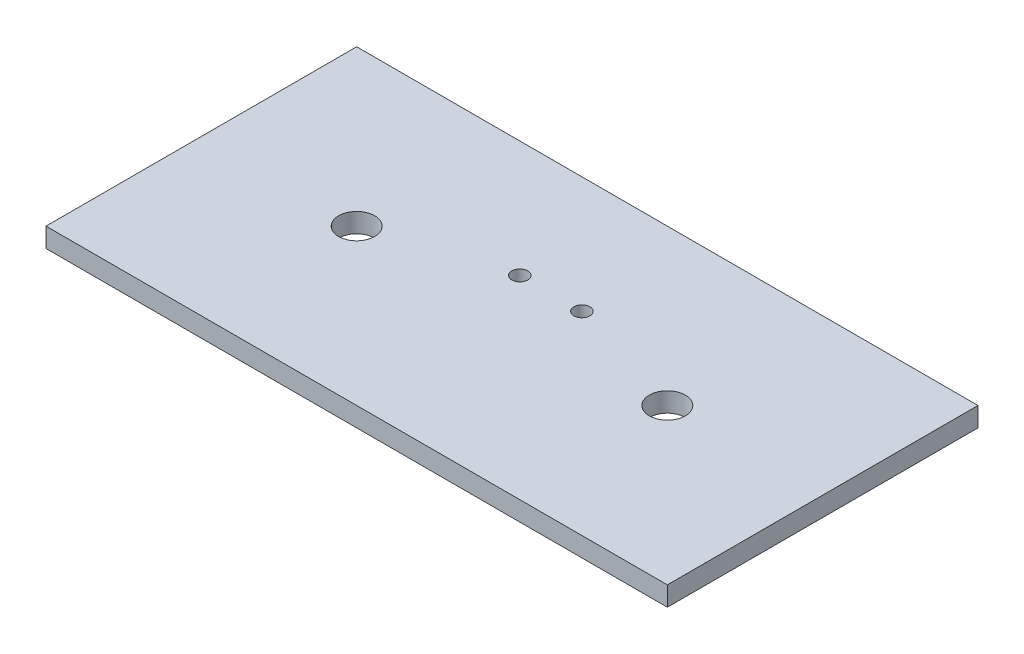
ISO-10303-21;
HEADER;
FILE_DESCRIPTION(('STEP AP214'),'2;1');
FILE_NAME('part.step','',(''),(''),'','','');
FILE_SCHEMA(('AUTOMOTIVE_DESIGN { 1 0 10303 214 1 1 1 1 }'));
ENDSEC;
DATA;
#1=APPLICATION_CONTEXT('core data for automotive mechanical design processes');
#2=APPLICATION_PROTOCOL_DEFINITION('international standard','automotive_design',2000,#1);
#3=PRODUCT_CONTEXT('',#1,'mechanical');
#4=PRODUCT('Part','Part','',(#3));
#5=PRODUCT_RELATED_PRODUCT_CATEGORY('part','',(#4));
#6=PRODUCT_DEFINITION_FORMATION('','',#4);
#7=PRODUCT_DEFINITION_CONTEXT('part definition',#1,'design');
#8=PRODUCT_DEFINITION('design','',#6,#7);
#9=PRODUCT_DEFINITION_SHAPE('','',#8);
#10=(LENGTH_UNIT() NAMED_UNIT(*) SI_UNIT(.MILLI.,.METRE.));
#11=(NAMED_UNIT(*) PLANE_ANGLE_UNIT() SI_UNIT($,.RADIAN.));
#12=(NAMED_UNIT(*) SI_UNIT($,.STERADIAN.) SOLID_ANGLE_UNIT());
#13=UNCERTAINTY_MEASURE_WITH_UNIT(LENGTH_MEASURE(1.E-05),#10,'distance_accuracy_value','');
#14=(GEOMETRIC_REPRESENTATION_CONTEXT(3) GLOBAL_UNCERTAINTY_ASSIGNED_CONTEXT((#13)) GLOBAL_UNIT_ASSIGNED_CONTEXT((#10,
#11,#12)) REPRESENTATION_CONTEXT('',''));
#15=CARTESIAN_POINT('',(0.,0.,0.));
#16=DIRECTION('',(0.,0.,1.));
#17=DIRECTION('',(1.,0.,0.));
#18=AXIS2_PLACEMENT_3D('',#15,#16,#17);
#19=CARTESIAN_POINT('',(0.,1.5875,0.));
#20=DIRECTION('',(0.,-1.,0.));
#21=DIRECTION('',(0.,0.,-1.));
#22=AXIS2_PLACEMENT_3D('',#19,#20,#21);
#23=PLANE('',#22);
#24=CARTESIAN_POINT('',(12.7,1.5875,0.));
#25=DIRECTION('',(0.,1.,0.));
#26=DIRECTION('',(0.,0.,1.));
#27=AXIS2_PLACEMENT_3D('',#24,#25,#26);
#28=CIRCLE('',#27,1.47319999999999);
#29=CARTESIAN_POINT('',(12.7,1.5875,1.47319999999998));
#30=VERTEX_POINT('',#29);
#31=EDGE_CURVE('E133',#30,#30,#28,.T.);
#32=ORIENTED_EDGE('',*,*,#31,.F.);
#33=EDGE_LOOP('',(#32));
#34=FACE_BOUND('',#33,.T.);
#35=CARTESIAN_POINT('',(-2.54,1.5875,-3.175));
#36=DIRECTION('',(0.,1.,0.));
#37=DIRECTION('',(0.,0.,1.));
#38=AXIS2_PLACEMENT_3D('',#35,#36,#37);
#39=CIRCLE('',#38,0.65);
#40=CARTESIAN_POINT('',(-2.54,1.5875,-2.525));
#41=VERTEX_POINT('',#40);
#42=EDGE_CURVE('E126',#41,#41,#39,.T.);
#43=ORIENTED_EDGE('',*,*,#42,.F.);
#44=EDGE_LOOP('',(#43));
#45=FACE_BOUND('',#44,.T.);
#46=CARTESIAN_POINT('',(2.54,1.5875,-3.175));
#47=DIRECTION('',(0.,1.,0.));
#48=DIRECTION('',(0.,0.,1.));
#49=AXIS2_PLACEMENT_3D('',#46,#47,#48);
#50=CIRCLE('',#49,0.65);
#51=CARTESIAN_POINT('',(2.54,1.5875,-2.525));
#52=VERTEX_POINT('',#51);
#53=EDGE_CURVE('E122',#52,#52,#50,.T.);
#54=ORIENTED_EDGE('',*,*,#53,.F.);
#55=EDGE_LOOP('',(#54));
#56=FACE_BOUND('',#55,.T.);
#57=DIRECTION('',(0.,0.,-1.));
#58=VECTOR('',#57,1.);
#59=CARTESIAN_POINT('',(25.4,1.5875,12.7));
#60=LINE('',#59,#58);
#61=CARTESIAN_POINT('',(25.4,1.5875,12.7));
#62=VERTEX_POINT('',#61);
#63=CARTESIAN_POINT('',(25.4,1.5875,-12.7));
#64=VERTEX_POINT('',#63);
#65=EDGE_CURVE('E93',#62,#64,#60,.T.);
#66=ORIENTED_EDGE('',*,*,#65,.T.);
#67=DIRECTION('',(-1.,0.,0.));
#68=VECTOR('',#67,1.);
#69=CARTESIAN_POINT('',(-25.4,1.5875,-12.7));
#70=LINE('',#69,#68);
#71=CARTESIAN_POINT('',(-25.4,1.5875,-12.7));
#72=VERTEX_POINT('',#71);
#73=EDGE_CURVE('E88',#64,#72,#70,.T.);
#74=ORIENTED_EDGE('',*,*,#73,.T.);
#75=DIRECTION('',(0.,0.,1.));
#76=VECTOR('',#75,1.);
#77=CARTESIAN_POINT('',(-25.4,1.5875,12.7));
#78=LINE('',#77,#76);
#79=CARTESIAN_POINT('',(-25.4,1.5875,12.7));
#80=VERTEX_POINT('',#79);
#81=EDGE_CURVE('E91',#72,#80,#78,.T.);
#82=ORIENTED_EDGE('',*,*,#81,.T.);
#83=DIRECTION('',(1.,0.,0.));
#84=VECTOR('',#83,1.);
#85=CARTESIAN_POINT('',(-25.4,1.5875,12.7));
#86=LINE('',#85,#84);
#87=EDGE_CURVE('E58',#80,#62,#86,.T.);
#88=ORIENTED_EDGE('',*,*,#87,.T.);
#89=EDGE_LOOP('',(#66,#74,#82,#88));
#90=FACE_BOUND('',#89,.T.);
#91=CARTESIAN_POINT('',(-12.7,1.5875,0.));
#92=DIRECTION('',(0.,1.,0.));
#93=DIRECTION('',(0.,0.,1.));
#94=AXIS2_PLACEMENT_3D('',#91,#92,#93);
#95=CIRCLE('',#94,1.47319999999999);
#96=CARTESIAN_POINT('',(-12.7,1.5875,1.47319999999999));
#97=VERTEX_POINT('',#96);
#98=EDGE_CURVE('E139',#97,#97,#95,.T.);
#99=ORIENTED_EDGE('',*,*,#98,.F.);
#100=EDGE_LOOP('',(#99));
#101=FACE_BOUND('',#100,.T.);
#102=ADVANCED_FACE('F41',(#34,#45,#56,#90,#101),#23,.F.);
#103=CARTESIAN_POINT('',(25.4,1.5875,12.7));
#104=DIRECTION('',(-1.,0.,0.));
#105=DIRECTION('',(0.,0.,1.));
#106=AXIS2_PLACEMENT_3D('',#103,#104,#105);
#107=PLANE('',#106);
#108=DIRECTION('',(0.,0.,-1.));
#109=VECTOR('',#108,1.);
#110=CARTESIAN_POINT('',(25.4,0.,12.7));
#111=LINE('',#110,#109);
#112=CARTESIAN_POINT('',(25.4,0.,12.7));
#113=VERTEX_POINT('',#112);
#114=CARTESIAN_POINT('',(25.4,0.,-12.7));
#115=VERTEX_POINT('',#114);
#116=EDGE_CURVE('E105',#113,#115,#111,.T.);
#117=ORIENTED_EDGE('',*,*,#116,.T.);
#118=DIRECTION('',(0.,-1.,0.));
#119=VECTOR('',#118,1.);
#120=CARTESIAN_POINT('',(25.4,1.5875,-12.7));
#121=LINE('',#120,#119);
#122=EDGE_CURVE('E11',#64,#115,#121,.T.);
#123=ORIENTED_EDGE('',*,*,#122,.F.);
#124=ORIENTED_EDGE('',*,*,#65,.F.);
#125=DIRECTION('',(0.,-1.,0.));
#126=VECTOR('',#125,1.);
#127=CARTESIAN_POINT('',(25.4,1.5875,12.7));
#128=LINE('',#127,#126);
#129=EDGE_CURVE('E101',#62,#113,#128,.T.);
#130=ORIENTED_EDGE('',*,*,#129,.T.);
#131=EDGE_LOOP('',(#117,#123,#124,#130));
#132=FACE_BOUND('',#131,.T.);
#133=ADVANCED_FACE('F43',(#132),#107,.F.);
#134=CARTESIAN_POINT('',(-25.4,1.5875,-12.7));
#135=DIRECTION('',(0.,0.,1.));
#136=DIRECTION('',(1.,0.,0.));
#137=AXIS2_PLACEMENT_3D('',#134,#135,#136);
#138=PLANE('',#137);
#139=DIRECTION('',(-1.,0.,0.));
#140=VECTOR('',#139,1.);
#141=CARTESIAN_POINT('',(-25.4,0.,-12.7));
#142=LINE('',#141,#140);
#143=CARTESIAN_POINT('',(-25.4,0.,-12.7));
#144=VERTEX_POINT('',#143);
#145=EDGE_CURVE('E97',#115,#144,#142,.T.);
#146=ORIENTED_EDGE('',*,*,#145,.T.);
#147=DIRECTION('',(0.,-1.,0.));
#148=VECTOR('',#147,1.);
#149=CARTESIAN_POINT('',(-25.4,1.5875,-12.7));
#150=LINE('',#149,#148);
#151=EDGE_CURVE('E50',#72,#144,#150,.T.);
#152=ORIENTED_EDGE('',*,*,#151,.F.);
#153=ORIENTED_EDGE('',*,*,#73,.F.);
#154=ORIENTED_EDGE('',*,*,#122,.T.);
#155=EDGE_LOOP('',(#146,#152,#153,#154));
#156=FACE_BOUND('',#155,.T.);
#157=ADVANCED_FACE('F96',(#156),#138,.F.);
#158=CARTESIAN_POINT('',(-25.4,1.5875,12.7));
#159=DIRECTION('',(1.,0.,0.));
#160=DIRECTION('',(0.,0.,-1.));
#161=AXIS2_PLACEMENT_3D('',#158,#159,#160);
#162=PLANE('',#161);
#163=DIRECTION('',(0.,0.,1.));
#164=VECTOR('',#163,1.);
#165=CARTESIAN_POINT('',(-25.4,0.,12.7));
#166=LINE('',#165,#164);
#167=CARTESIAN_POINT('',(-25.4,0.,12.7));
#168=VERTEX_POINT('',#167);
#169=EDGE_CURVE('E75',#144,#168,#166,.T.);
#170=ORIENTED_EDGE('',*,*,#169,.T.);
#171=DIRECTION('',(0.,-1.,0.));
#172=VECTOR('',#171,1.);
#173=CARTESIAN_POINT('',(-25.4,1.5875,12.7));
#174=LINE('',#173,#172);
#175=EDGE_CURVE('E98',#80,#168,#174,.T.);
#176=ORIENTED_EDGE('',*,*,#175,.F.);
#177=ORIENTED_EDGE('',*,*,#81,.F.);
#178=ORIENTED_EDGE('',*,*,#151,.T.);
#179=EDGE_LOOP('',(#170,#176,#177,#178));
#180=FACE_BOUND('',#179,.T.);
#181=ADVANCED_FACE('F99',(#180),#162,.F.);
#182=CARTESIAN_POINT('',(-25.4,1.5875,12.7));
#183=DIRECTION('',(0.,0.,-1.));
#184=DIRECTION('',(-1.,0.,0.));
#185=AXIS2_PLACEMENT_3D('',#182,#183,#184);
#186=PLANE('',#185);
#187=DIRECTION('',(1.,0.,0.));
#188=VECTOR('',#187,1.);
#189=CARTESIAN_POINT('',(-25.4,0.,12.7));
#190=LINE('',#189,#188);
#191=EDGE_CURVE('E81',#168,#113,#190,.T.);
#192=ORIENTED_EDGE('',*,*,#191,.T.);
#193=ORIENTED_EDGE('',*,*,#129,.F.);
#194=ORIENTED_EDGE('',*,*,#87,.F.);
#195=ORIENTED_EDGE('',*,*,#175,.T.);
#196=EDGE_LOOP('',(#192,#193,#194,#195));
#197=FACE_BOUND('',#196,.T.);
#198=ADVANCED_FACE('F113',(#197),#186,.F.);
#199=CARTESIAN_POINT('',(0.,0.,0.));
#200=DIRECTION('',(0.,-1.,0.));
#201=DIRECTION('',(0.,0.,-1.));
#202=AXIS2_PLACEMENT_3D('',#199,#200,#201);
#203=PLANE('',#202);
#204=CARTESIAN_POINT('',(-12.7,0.,0.));
#205=DIRECTION('',(0.,1.,0.));
#206=DIRECTION('',(0.,0.,1.));
#207=AXIS2_PLACEMENT_3D('',#204,#205,#206);
#208=CIRCLE('',#207,1.4732);
#209=CARTESIAN_POINT('',(-12.7,0.,1.4732));
#210=VERTEX_POINT('',#209);
#211=EDGE_CURVE('E136',#210,#210,#208,.T.);
#212=ORIENTED_EDGE('',*,*,#211,.T.);
#213=EDGE_LOOP('',(#212));
#214=FACE_BOUND('',#213,.T.);
#215=CARTESIAN_POINT('',(12.7,0.,0.));
#216=DIRECTION('',(0.,1.,0.));
#217=DIRECTION('',(0.,0.,1.));
#218=AXIS2_PLACEMENT_3D('',#215,#216,#217);
#219=CIRCLE('',#218,1.4732);
#220=CARTESIAN_POINT('',(12.7,0.,1.47319999999999));
#221=VERTEX_POINT('',#220);
#222=EDGE_CURVE('E123',#221,#221,#219,.T.);
#223=ORIENTED_EDGE('',*,*,#222,.T.);
#224=EDGE_LOOP('',(#223));
#225=FACE_BOUND('',#224,.T.);
#226=CARTESIAN_POINT('',(-2.54,0.,-3.175));
#227=DIRECTION('',(0.,1.,0.));
#228=DIRECTION('',(0.,0.,1.));
#229=AXIS2_PLACEMENT_3D('',#226,#227,#228);
#230=CIRCLE('',#229,0.65);
#231=CARTESIAN_POINT('',(-2.54,0.,-2.525));
#232=VERTEX_POINT('',#231);
#233=EDGE_CURVE('E108',#232,#232,#230,.T.);
#234=ORIENTED_EDGE('',*,*,#233,.T.);
#235=EDGE_LOOP('',(#234));
#236=FACE_BOUND('',#235,.T.);
#237=CARTESIAN_POINT('',(2.54,0.,-3.175));
#238=DIRECTION('',(0.,1.,0.));
#239=DIRECTION('',(0.,0.,1.));
#240=AXIS2_PLACEMENT_3D('',#237,#238,#239);
#241=CIRCLE('',#240,0.65);
#242=CARTESIAN_POINT('',(2.54,0.,-2.525));
#243=VERTEX_POINT('',#242);
#244=EDGE_CURVE('E119',#243,#243,#241,.T.);
#245=ORIENTED_EDGE('',*,*,#244,.T.);
#246=EDGE_LOOP('',(#245));
#247=FACE_BOUND('',#246,.T.);
#248=ORIENTED_EDGE('',*,*,#116,.F.);
#249=ORIENTED_EDGE('',*,*,#191,.F.);
#250=ORIENTED_EDGE('',*,*,#169,.F.);
#251=ORIENTED_EDGE('',*,*,#145,.F.);
#252=EDGE_LOOP('',(#248,#249,#250,#251));
#253=FACE_BOUND('',#252,.T.);
#254=ADVANCED_FACE('F116',(#214,#225,#236,#247,#253),#203,.T.);
#255=CARTESIAN_POINT('',(2.54,0.,-3.175));
#256=DIRECTION('',(0.,1.,0.));
#257=DIRECTION('',(0.,0.,1.));
#258=AXIS2_PLACEMENT_3D('',#255,#256,#257);
#259=CYLINDRICAL_SURFACE('',#258,0.65);
#260=ORIENTED_EDGE('',*,*,#244,.F.);
#261=EDGE_LOOP('',(#260));
#262=FACE_BOUND('',#261,.T.);
#263=ORIENTED_EDGE('',*,*,#53,.T.);
#264=EDGE_LOOP('',(#263));
#265=FACE_BOUND('',#264,.T.);
#266=ADVANCED_FACE('F156',(#262,#265),#259,.F.);
#267=CARTESIAN_POINT('',(-2.54,0.,-3.175));
#268=DIRECTION('',(0.,1.,0.));
#269=DIRECTION('',(0.,0.,1.));
#270=AXIS2_PLACEMENT_3D('',#267,#268,#269);
#271=CYLINDRICAL_SURFACE('',#270,0.65);
#272=ORIENTED_EDGE('',*,*,#233,.F.);
#273=EDGE_LOOP('',(#272));
#274=FACE_BOUND('',#273,.T.);
#275=ORIENTED_EDGE('',*,*,#42,.T.);
#276=EDGE_LOOP('',(#275));
#277=FACE_BOUND('',#276,.T.);
#278=ADVANCED_FACE('F185',(#274,#277),#271,.F.);
#279=CARTESIAN_POINT('',(12.7,1.5875,0.));
#280=DIRECTION('',(0.,1.,0.));
#281=DIRECTION('',(0.,0.,1.));
#282=AXIS2_PLACEMENT_3D('',#279,#280,#281);
#283=CYLINDRICAL_SURFACE('',#282,1.47319999999999);
#284=ORIENTED_EDGE('',*,*,#222,.F.);
#285=EDGE_LOOP('',(#284));
#286=FACE_BOUND('',#285,.T.);
#287=ORIENTED_EDGE('',*,*,#31,.T.);
#288=EDGE_LOOP('',(#287));
#289=FACE_BOUND('',#288,.T.);
#290=ADVANCED_FACE('F192',(#286,#289),#283,.F.);
#291=CARTESIAN_POINT('',(-12.7,1.5875,0.));
#292=DIRECTION('',(0.,1.,0.));
#293=DIRECTION('',(0.,0.,1.));
#294=AXIS2_PLACEMENT_3D('',#291,#292,#293);
#295=CYLINDRICAL_SURFACE('',#294,1.47319999999999);
#296=ORIENTED_EDGE('',*,*,#211,.F.);
#297=EDGE_LOOP('',(#296));
#298=FACE_BOUND('',#297,.T.);
#299=ORIENTED_EDGE('',*,*,#98,.T.);
#300=EDGE_LOOP('',(#299));
#301=FACE_BOUND('',#300,.T.);
#302=ADVANCED_FACE('F143',(#298,#301),#295,.F.);
#303=CLOSED_SHELL('',(#102,#133,#157,#181,#198,#254,#266,#278,#290,#302));
#304=MANIFOLD_SOLID_BREP('B2',#303);
#305=ADVANCED_BREP_SHAPE_REPRESENTATION('',(#18,#304),#14);
#306=SHAPE_DEFINITION_REPRESENTATION(#9,#305);
ENDSEC;
END-ISO-10303-21;
